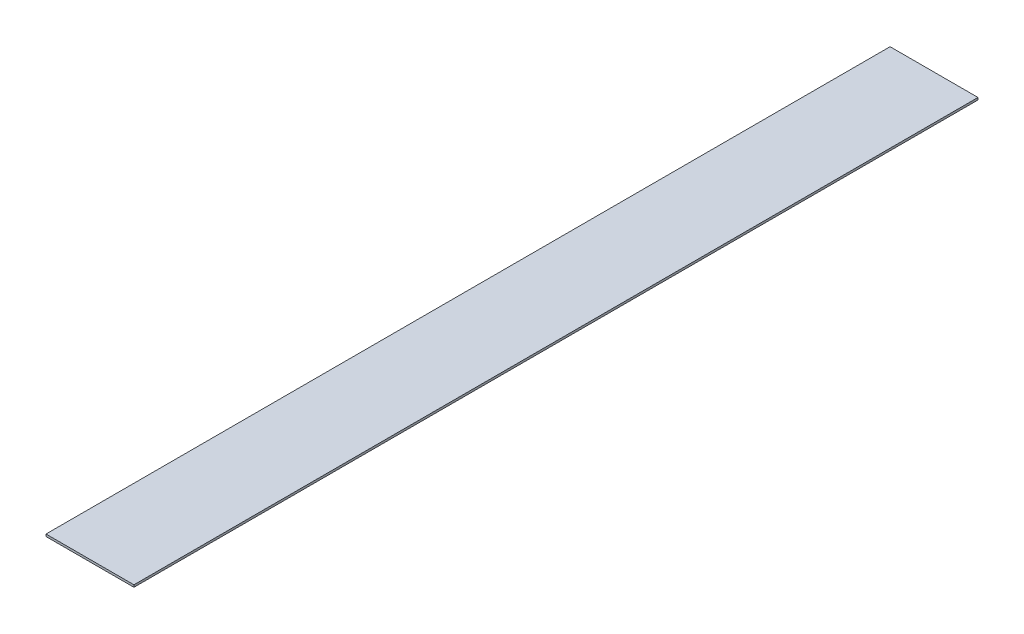
ISO-10303-21;
HEADER;
FILE_DESCRIPTION(('STEP AP214'),'2;1');
FILE_NAME('part.step','',(''),(''),'','','');
FILE_SCHEMA(('AUTOMOTIVE_DESIGN { 1 0 10303 214 1 1 1 1 }'));
ENDSEC;
DATA;
#1=APPLICATION_CONTEXT('core data for automotive mechanical design processes');
#2=APPLICATION_PROTOCOL_DEFINITION('international standard','automotive_design',2000,#1);
#3=PRODUCT_CONTEXT('',#1,'mechanical');
#4=PRODUCT('Part','Part','',(#3));
#5=PRODUCT_RELATED_PRODUCT_CATEGORY('part','',(#4));
#6=PRODUCT_DEFINITION_FORMATION('','',#4);
#7=PRODUCT_DEFINITION_CONTEXT('part definition',#1,'design');
#8=PRODUCT_DEFINITION('design','',#6,#7);
#9=PRODUCT_DEFINITION_SHAPE('','',#8);
#10=(LENGTH_UNIT() NAMED_UNIT(*) SI_UNIT(.MILLI.,.METRE.));
#11=(NAMED_UNIT(*) PLANE_ANGLE_UNIT() SI_UNIT($,.RADIAN.));
#12=(NAMED_UNIT(*) SI_UNIT($,.STERADIAN.) SOLID_ANGLE_UNIT());
#13=UNCERTAINTY_MEASURE_WITH_UNIT(LENGTH_MEASURE(1.E-05),#10,'distance_accuracy_value','');
#14=(GEOMETRIC_REPRESENTATION_CONTEXT(3) GLOBAL_UNCERTAINTY_ASSIGNED_CONTEXT((#13)) GLOBAL_UNIT_ASSIGNED_CONTEXT((#10,
#11,#12)) REPRESENTATION_CONTEXT('',''));
#15=CARTESIAN_POINT('',(0.,0.,0.));
#16=DIRECTION('',(0.,0.,1.));
#17=DIRECTION('',(1.,0.,0.));
#18=AXIS2_PLACEMENT_3D('',#15,#16,#17);
#19=CARTESIAN_POINT('',(99.9999999999999,2.5,960.));
#20=DIRECTION('',(-1.,0.,0.));
#21=DIRECTION('',(0.,0.,1.));
#22=AXIS2_PLACEMENT_3D('',#19,#20,#21);
#23=PLANE('',#22);
#24=DIRECTION('',(0.,1.,0.));
#25=VECTOR('',#24,1.);
#26=CARTESIAN_POINT('',(99.9999999999999,2.5,-960.));
#27=LINE('',#26,#25);
#28=CARTESIAN_POINT('',(99.9999999999999,-2.5,-960.));
#29=VERTEX_POINT('',#28);
#30=CARTESIAN_POINT('',(99.9999999999999,2.5,-960.));
#31=VERTEX_POINT('',#30);
#32=EDGE_CURVE('E98',#29,#31,#27,.T.);
#33=ORIENTED_EDGE('',*,*,#32,.T.);
#34=DIRECTION('',(0.,0.,-1.));
#35=VECTOR('',#34,1.);
#36=CARTESIAN_POINT('',(99.9999999999999,2.5,960.));
#37=LINE('',#36,#35);
#38=CARTESIAN_POINT('',(99.9999999999999,2.5,960.));
#39=VERTEX_POINT('',#38);
#40=EDGE_CURVE('E11',#39,#31,#37,.T.);
#41=ORIENTED_EDGE('',*,*,#40,.F.);
#42=DIRECTION('',(0.,1.,0.));
#43=VECTOR('',#42,1.);
#44=CARTESIAN_POINT('',(99.9999999999999,2.5,960.));
#45=LINE('',#44,#43);
#46=CARTESIAN_POINT('',(99.9999999999999,-2.5,960.));
#47=VERTEX_POINT('',#46);
#48=EDGE_CURVE('E86',#47,#39,#45,.T.);
#49=ORIENTED_EDGE('',*,*,#48,.F.);
#50=DIRECTION('',(0.,0.,-1.));
#51=VECTOR('',#50,1.);
#52=CARTESIAN_POINT('',(99.9999999999999,-2.5,960.));
#53=LINE('',#52,#51);
#54=EDGE_CURVE('E94',#47,#29,#53,.T.);
#55=ORIENTED_EDGE('',*,*,#54,.T.);
#56=EDGE_LOOP('',(#33,#41,#49,#55));
#57=FACE_BOUND('',#56,.T.);
#58=ADVANCED_FACE('F35',(#57),#23,.F.);
#59=CARTESIAN_POINT('',(-100.,2.5,960.));
#60=DIRECTION('',(0.,-1.,0.));
#61=DIRECTION('',(0.,0.,-1.));
#62=AXIS2_PLACEMENT_3D('',#59,#60,#61);
#63=PLANE('',#62);
#64=DIRECTION('',(-1.,0.,0.));
#65=VECTOR('',#64,1.);
#66=CARTESIAN_POINT('',(-100.,2.5,-960.));
#67=LINE('',#66,#65);
#68=CARTESIAN_POINT('',(-100.,2.5,-960.));
#69=VERTEX_POINT('',#68);
#70=EDGE_CURVE('E90',#31,#69,#67,.T.);
#71=ORIENTED_EDGE('',*,*,#70,.T.);
#72=DIRECTION('',(0.,0.,-1.));
#73=VECTOR('',#72,1.);
#74=CARTESIAN_POINT('',(-100.,2.5,960.));
#75=LINE('',#74,#73);
#76=CARTESIAN_POINT('',(-100.,2.5,960.));
#77=VERTEX_POINT('',#76);
#78=EDGE_CURVE('E43',#77,#69,#75,.T.);
#79=ORIENTED_EDGE('',*,*,#78,.F.);
#80=DIRECTION('',(-1.,0.,0.));
#81=VECTOR('',#80,1.);
#82=CARTESIAN_POINT('',(-100.,2.5,960.));
#83=LINE('',#82,#81);
#84=EDGE_CURVE('E81',#39,#77,#83,.T.);
#85=ORIENTED_EDGE('',*,*,#84,.F.);
#86=ORIENTED_EDGE('',*,*,#40,.T.);
#87=EDGE_LOOP('',(#71,#79,#85,#86));
#88=FACE_BOUND('',#87,.T.);
#89=ADVANCED_FACE('F89',(#88),#63,.F.);
#90=CARTESIAN_POINT('',(-100.,2.5,960.));
#91=DIRECTION('',(1.,0.,0.));
#92=DIRECTION('',(0.,0.,-1.));
#93=AXIS2_PLACEMENT_3D('',#90,#91,#92);
#94=PLANE('',#93);
#95=DIRECTION('',(0.,-1.,0.));
#96=VECTOR('',#95,1.);
#97=CARTESIAN_POINT('',(-100.,2.5,-960.));
#98=LINE('',#97,#96);
#99=CARTESIAN_POINT('',(-100.,-2.5,-960.));
#100=VERTEX_POINT('',#99);
#101=EDGE_CURVE('E68',#69,#100,#98,.T.);
#102=ORIENTED_EDGE('',*,*,#101,.T.);
#103=DIRECTION('',(0.,0.,-1.));
#104=VECTOR('',#103,1.);
#105=CARTESIAN_POINT('',(-100.,-2.5,960.));
#106=LINE('',#105,#104);
#107=CARTESIAN_POINT('',(-100.,-2.5,960.));
#108=VERTEX_POINT('',#107);
#109=EDGE_CURVE('E91',#108,#100,#106,.T.);
#110=ORIENTED_EDGE('',*,*,#109,.F.);
#111=DIRECTION('',(0.,-1.,0.));
#112=VECTOR('',#111,1.);
#113=CARTESIAN_POINT('',(-100.,2.5,960.));
#114=LINE('',#113,#112);
#115=EDGE_CURVE('E84',#77,#108,#114,.T.);
#116=ORIENTED_EDGE('',*,*,#115,.F.);
#117=ORIENTED_EDGE('',*,*,#78,.T.);
#118=EDGE_LOOP('',(#102,#110,#116,#117));
#119=FACE_BOUND('',#118,.T.);
#120=ADVANCED_FACE('F92',(#119),#94,.F.);
#121=CARTESIAN_POINT('',(-100.,-2.5,960.));
#122=DIRECTION('',(0.,1.,0.));
#123=DIRECTION('',(0.,0.,1.));
#124=AXIS2_PLACEMENT_3D('',#121,#122,#123);
#125=PLANE('',#124);
#126=DIRECTION('',(1.,0.,0.));
#127=VECTOR('',#126,1.);
#128=CARTESIAN_POINT('',(-100.,-2.5,-960.));
#129=LINE('',#128,#127);
#130=EDGE_CURVE('E74',#100,#29,#129,.T.);
#131=ORIENTED_EDGE('',*,*,#130,.T.);
#132=ORIENTED_EDGE('',*,*,#54,.F.);
#133=DIRECTION('',(1.,0.,0.));
#134=VECTOR('',#133,1.);
#135=CARTESIAN_POINT('',(-100.,-2.5,960.));
#136=LINE('',#135,#134);
#137=EDGE_CURVE('E51',#108,#47,#136,.T.);
#138=ORIENTED_EDGE('',*,*,#137,.F.);
#139=ORIENTED_EDGE('',*,*,#109,.T.);
#140=EDGE_LOOP('',(#131,#132,#138,#139));
#141=FACE_BOUND('',#140,.T.);
#142=ADVANCED_FACE('F105',(#141),#125,.F.);
#143=CARTESIAN_POINT('',(0.,0.,960.));
#144=DIRECTION('',(0.,0.,1.));
#145=DIRECTION('',(1.,0.,0.));
#146=AXIS2_PLACEMENT_3D('',#143,#144,#145);
#147=PLANE('',#146);
#148=ORIENTED_EDGE('',*,*,#48,.T.);
#149=ORIENTED_EDGE('',*,*,#84,.T.);
#150=ORIENTED_EDGE('',*,*,#115,.T.);
#151=ORIENTED_EDGE('',*,*,#137,.T.);
#152=EDGE_LOOP('',(#148,#149,#150,#151));
#153=FACE_BOUND('',#152,.T.);
#154=ADVANCED_FACE('F82',(#153),#147,.T.);
#155=CARTESIAN_POINT('',(0.,0.,-960.));
#156=DIRECTION('',(0.,0.,1.));
#157=DIRECTION('',(1.,0.,0.));
#158=AXIS2_PLACEMENT_3D('',#155,#156,#157);
#159=PLANE('',#158);
#160=ORIENTED_EDGE('',*,*,#32,.F.);
#161=ORIENTED_EDGE('',*,*,#130,.F.);
#162=ORIENTED_EDGE('',*,*,#101,.F.);
#163=ORIENTED_EDGE('',*,*,#70,.F.);
#164=EDGE_LOOP('',(#160,#161,#162,#163));
#165=FACE_BOUND('',#164,.T.);
#166=ADVANCED_FACE('F108',(#165),#159,.F.);
#167=CLOSED_SHELL('',(#58,#89,#120,#142,#154,#166));
#168=MANIFOLD_SOLID_BREP('B2',#167);
#169=ADVANCED_BREP_SHAPE_REPRESENTATION('',(#18,#168),#14);
#170=SHAPE_DEFINITION_REPRESENTATION(#9,#169);
ENDSEC;
END-ISO-10303-21;
